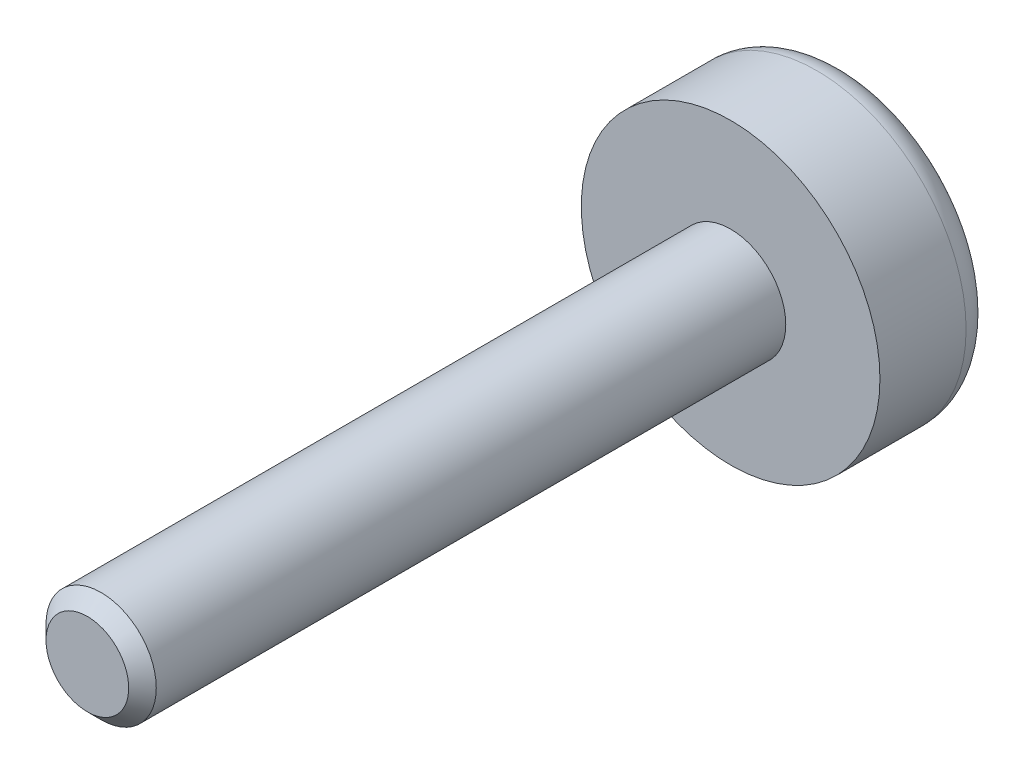
ISO-10303-21;
HEADER;
FILE_DESCRIPTION(('STEP AP214'),'2;1');
FILE_NAME('part.step','',(''),(''),'','','');
FILE_SCHEMA(('AUTOMOTIVE_DESIGN { 1 0 10303 214 1 1 1 1 }'));
ENDSEC;
DATA;
#1=APPLICATION_CONTEXT('core data for automotive mechanical design processes');
#2=APPLICATION_PROTOCOL_DEFINITION('international standard','automotive_design',2000,#1);
#3=PRODUCT_CONTEXT('',#1,'mechanical');
#4=PRODUCT('Part','Part','',(#3));
#5=PRODUCT_RELATED_PRODUCT_CATEGORY('part','',(#4));
#6=PRODUCT_DEFINITION_FORMATION('','',#4);
#7=PRODUCT_DEFINITION_CONTEXT('part definition',#1,'design');
#8=PRODUCT_DEFINITION('design','',#6,#7);
#9=PRODUCT_DEFINITION_SHAPE('','',#8);
#10=(LENGTH_UNIT() NAMED_UNIT(*) SI_UNIT(.MILLI.,.METRE.));
#11=(NAMED_UNIT(*) PLANE_ANGLE_UNIT() SI_UNIT($,.RADIAN.));
#12=(NAMED_UNIT(*) SI_UNIT($,.STERADIAN.) SOLID_ANGLE_UNIT());
#13=UNCERTAINTY_MEASURE_WITH_UNIT(LENGTH_MEASURE(1.E-05),#10,'distance_accuracy_value','');
#14=(GEOMETRIC_REPRESENTATION_CONTEXT(3) GLOBAL_UNCERTAINTY_ASSIGNED_CONTEXT((#13)) GLOBAL_UNIT_ASSIGNED_CONTEXT((#10,
#11,#12)) REPRESENTATION_CONTEXT('',''));
#15=CARTESIAN_POINT('',(0.,0.,0.));
#16=DIRECTION('',(0.,0.,1.));
#17=DIRECTION('',(1.,0.,0.));
#18=AXIS2_PLACEMENT_3D('',#15,#16,#17);
#19=CARTESIAN_POINT('',(0.,0.,14.));
#20=DIRECTION('',(0.,0.,1.));
#21=DIRECTION('',(-1.,0.,0.));
#22=AXIS2_PLACEMENT_3D('',#19,#20,#21);
#23=PLANE('',#22);
#24=CARTESIAN_POINT('',(0.,0.,14.));
#25=DIRECTION('',(0.,0.,-1.));
#26=DIRECTION('',(-1.,0.,0.));
#27=AXIS2_PLACEMENT_3D('',#24,#25,#26);
#28=CIRCLE('',#27,0.899999999999988);
#29=CARTESIAN_POINT('',(-0.899999999999988,0.,14.));
#30=VERTEX_POINT('',#29);
#31=EDGE_CURVE('E140',#30,#30,#28,.T.);
#32=ORIENTED_EDGE('',*,*,#31,.F.);
#33=EDGE_LOOP('',(#32));
#34=FACE_BOUND('',#33,.T.);
#35=ADVANCED_FACE('F41',(#34),#23,.T.);
#36=CARTESIAN_POINT('',(0.,0.,-10.123));
#37=DIRECTION('',(0.,0.,-1.));
#38=DIRECTION('',(1.,0.,0.));
#39=AXIS2_PLACEMENT_3D('',#36,#37,#38);
#40=CYLINDRICAL_SURFACE('',#39,1.2);
#41=CARTESIAN_POINT('',(0.,0.,13.7));
#42=DIRECTION('',(0.,0.,-1.));
#43=DIRECTION('',(-1.,0.,0.));
#44=AXIS2_PLACEMENT_3D('',#41,#42,#43);
#45=CIRCLE('',#44,1.2);
#46=CARTESIAN_POINT('',(-1.2,0.,13.7));
#47=VERTEX_POINT('',#46);
#48=EDGE_CURVE('E137',#47,#47,#45,.F.);
#49=ORIENTED_EDGE('',*,*,#48,.F.);
#50=EDGE_LOOP('',(#49));
#51=FACE_BOUND('',#50,.T.);
#52=CARTESIAN_POINT('',(0.,0.,0.));
#53=DIRECTION('',(0.,0.,1.));
#54=DIRECTION('',(1.,0.,0.));
#55=AXIS2_PLACEMENT_3D('',#52,#53,#54);
#56=CIRCLE('',#55,1.2);
#57=CARTESIAN_POINT('',(1.2,0.,0.));
#58=VERTEX_POINT('',#57);
#59=EDGE_CURVE('E134',#58,#58,#56,.T.);
#60=ORIENTED_EDGE('',*,*,#59,.T.);
#61=EDGE_LOOP('',(#60));
#62=FACE_BOUND('',#61,.T.);
#63=ADVANCED_FACE('F163',(#51,#62),#40,.T.);
#64=CARTESIAN_POINT('',(1.2,0.,0.));
#65=DIRECTION('',(0.,0.,1.));
#66=DIRECTION('',(-1.,0.,0.));
#67=AXIS2_PLACEMENT_3D('',#64,#65,#66);
#68=PLANE('',#67);
#69=ORIENTED_EDGE('',*,*,#59,.F.);
#70=EDGE_LOOP('',(#69));
#71=FACE_BOUND('',#70,.T.);
#72=CARTESIAN_POINT('',(0.,0.,0.));
#73=DIRECTION('',(0.,0.,1.));
#74=DIRECTION('',(1.,0.,0.));
#75=AXIS2_PLACEMENT_3D('',#72,#73,#74);
#76=CIRCLE('',#75,3.25);
#77=CARTESIAN_POINT('',(3.25,0.,0.));
#78=VERTEX_POINT('',#77);
#79=EDGE_CURVE('E131',#78,#78,#76,.T.);
#80=ORIENTED_EDGE('',*,*,#79,.T.);
#81=EDGE_LOOP('',(#80));
#82=FACE_BOUND('',#81,.T.);
#83=ADVANCED_FACE('F157',(#71,#82),#68,.T.);
#84=CARTESIAN_POINT('',(0.,0.,-10.123));
#85=DIRECTION('',(0.,0.,-1.));
#86=DIRECTION('',(1.,0.,0.));
#87=AXIS2_PLACEMENT_3D('',#84,#85,#86);
#88=CYLINDRICAL_SURFACE('',#87,3.25);
#89=CARTESIAN_POINT('',(0.,0.,-1.875));
#90=DIRECTION('',(0.,0.,1.));
#91=DIRECTION('',(1.,0.,0.));
#92=AXIS2_PLACEMENT_3D('',#89,#90,#91);
#93=CIRCLE('',#92,3.25);
#94=CARTESIAN_POINT('',(3.25,0.,-1.875));
#95=VERTEX_POINT('',#94);
#96=EDGE_CURVE('E11',#95,#95,#93,.F.);
#97=ORIENTED_EDGE('',*,*,#96,.F.);
#98=EDGE_LOOP('',(#97));
#99=FACE_BOUND('',#98,.T.);
#100=ORIENTED_EDGE('',*,*,#79,.F.);
#101=EDGE_LOOP('',(#100));
#102=FACE_BOUND('',#101,.T.);
#103=ADVANCED_FACE('F149',(#99,#102),#88,.T.);
#104=CARTESIAN_POINT('',(3.25,0.,-2.5));
#105=DIRECTION('',(0.,0.,-1.));
#106=DIRECTION('',(1.,0.,0.));
#107=AXIS2_PLACEMENT_3D('',#104,#105,#106);
#108=PLANE('',#107);
#109=DIRECTION('',(0.499999999999995,0.866025403784441,0.));
#110=VECTOR('',#109,1.);
#111=CARTESIAN_POINT('',(0.577350269189637,-0.999999999999993,-2.5));
#112=LINE('',#111,#110);
#113=CARTESIAN_POINT('',(0.577350269189637,-0.999999999999993,-2.5));
#114=VERTEX_POINT('',#113);
#115=CARTESIAN_POINT('',(1.15470053837925,0.,-2.5));
#116=VERTEX_POINT('',#115);
#117=EDGE_CURVE('E315',#114,#116,#112,.T.);
#118=ORIENTED_EDGE('',*,*,#117,.T.);
#119=DIRECTION('',(-0.500000000000001,0.866025403784438,0.));
#120=VECTOR('',#119,1.);
#121=CARTESIAN_POINT('',(1.15470053837925,0.,-2.5));
#122=LINE('',#121,#120);
#123=CARTESIAN_POINT('',(0.577350269189624,1.,-2.5));
#124=VERTEX_POINT('',#123);
#125=EDGE_CURVE('E310',#116,#124,#122,.T.);
#126=ORIENTED_EDGE('',*,*,#125,.T.);
#127=DIRECTION('',(-1.,0.,0.));
#128=VECTOR('',#127,1.);
#129=CARTESIAN_POINT('',(0.577350269189624,1.,-2.5));
#130=LINE('',#129,#128);
#131=CARTESIAN_POINT('',(-0.57735026918963,0.999999999999998,-2.5));
#132=VERTEX_POINT('',#131);
#133=EDGE_CURVE('E314',#124,#132,#130,.T.);
#134=ORIENTED_EDGE('',*,*,#133,.T.);
#135=DIRECTION('',(-0.499999999999995,-0.866025403784442,0.));
#136=VECTOR('',#135,1.);
#137=CARTESIAN_POINT('',(-0.57735026918963,0.999999999999998,-2.5));
#138=LINE('',#137,#136);
#139=CARTESIAN_POINT('',(-1.15470053837925,0.,-2.5));
#140=VERTEX_POINT('',#139);
#141=EDGE_CURVE('E322',#132,#140,#138,.T.);
#142=ORIENTED_EDGE('',*,*,#141,.T.);
#143=DIRECTION('',(0.500000000000007,-0.866025403784434,0.));
#144=VECTOR('',#143,1.);
#145=CARTESIAN_POINT('',(-1.15470053837925,0.,-2.5));
#146=LINE('',#145,#144);
#147=CARTESIAN_POINT('',(-0.577350269189617,-1.00000000000001,-2.5));
#148=VERTEX_POINT('',#147);
#149=EDGE_CURVE('E120',#140,#148,#146,.T.);
#150=ORIENTED_EDGE('',*,*,#149,.T.);
#151=DIRECTION('',(1.,0.,0.));
#152=VECTOR('',#151,1.);
#153=CARTESIAN_POINT('',(-0.577350269189617,-1.00000000000001,-2.5));
#154=LINE('',#153,#152);
#155=EDGE_CURVE('E317',#148,#114,#154,.T.);
#156=ORIENTED_EDGE('',*,*,#155,.T.);
#157=EDGE_LOOP('',(#118,#126,#134,#142,#150,#156));
#158=FACE_BOUND('',#157,.T.);
#159=CARTESIAN_POINT('',(0.,0.,-2.5));
#160=DIRECTION('',(0.,0.,1.));
#161=DIRECTION('',(1.,0.,0.));
#162=AXIS2_PLACEMENT_3D('',#159,#160,#161);
#163=CIRCLE('',#162,2.625);
#164=CARTESIAN_POINT('',(2.625,0.,-2.5));
#165=VERTEX_POINT('',#164);
#166=EDGE_CURVE('E49',#165,#165,#163,.T.);
#167=ORIENTED_EDGE('',*,*,#166,.F.);
#168=EDGE_LOOP('',(#167));
#169=FACE_BOUND('',#168,.T.);
#170=ADVANCED_FACE('F146',(#158,#169),#108,.T.);
#171=CARTESIAN_POINT('',(0.,0.,13.7));
#172=DIRECTION('',(0.,0.,-1.));
#173=DIRECTION('',(1.,0.,0.));
#174=AXIS2_PLACEMENT_3D('',#171,#172,#173);
#175=CONICAL_SURFACE('',#174,1.2,0.785398163397451);
#176=ORIENTED_EDGE('',*,*,#31,.T.);
#177=EDGE_LOOP('',(#176));
#178=FACE_BOUND('',#177,.T.);
#179=ORIENTED_EDGE('',*,*,#48,.T.);
#180=EDGE_LOOP('',(#179));
#181=FACE_BOUND('',#180,.T.);
#182=ADVANCED_FACE('F148',(#178,#181),#175,.T.);
#183=CARTESIAN_POINT('',(0.,0.,-1.875));
#184=DIRECTION('',(0.,0.,-1.));
#185=DIRECTION('',(1.,0.,0.));
#186=AXIS2_PLACEMENT_3D('',#183,#184,#185);
#187=TOROIDAL_SURFACE('',#186,2.625,0.625);
#188=ORIENTED_EDGE('',*,*,#96,.T.);
#189=EDGE_LOOP('',(#188));
#190=FACE_BOUND('',#189,.T.);
#191=ORIENTED_EDGE('',*,*,#166,.T.);
#192=EDGE_LOOP('',(#191));
#193=FACE_BOUND('',#192,.T.);
#194=ADVANCED_FACE('F43',(#190,#193),#187,.T.);
#195=CARTESIAN_POINT('',(0.577350269189637,-0.999999999999993,-1.125));
#196=DIRECTION('',(0.866025403784441,-0.499999999999995,0.));
#197=DIRECTION('',(0.499999999999995,0.866025403784441,0.));
#198=AXIS2_PLACEMENT_3D('',#195,#196,#197);
#199=PLANE('',#198);
#200=ORIENTED_EDGE('',*,*,#117,.F.);
#201=DIRECTION('',(0.,0.,-1.));
#202=VECTOR('',#201,1.);
#203=CARTESIAN_POINT('',(0.577350269189637,-0.999999999999993,-1.125));
#204=LINE('',#203,#202);
#205=CARTESIAN_POINT('',(0.577350269189637,-0.999999999999993,-1.125));
#206=VERTEX_POINT('',#205);
#207=EDGE_CURVE('E87',#206,#114,#204,.T.);
#208=ORIENTED_EDGE('',*,*,#207,.F.);
#209=DIRECTION('',(0.499999999999995,0.866025403784441,0.));
#210=VECTOR('',#209,1.);
#211=CARTESIAN_POINT('',(0.577350269189637,-0.999999999999993,-1.125));
#212=LINE('',#211,#210);
#213=CARTESIAN_POINT('',(1.15470053837925,0.,-1.125));
#214=VERTEX_POINT('',#213);
#215=EDGE_CURVE('E325',#206,#214,#212,.T.);
#216=ORIENTED_EDGE('',*,*,#215,.T.);
#217=DIRECTION('',(0.,0.,-1.));
#218=VECTOR('',#217,1.);
#219=CARTESIAN_POINT('',(1.15470053837925,0.,-1.125));
#220=LINE('',#219,#218);
#221=EDGE_CURVE('E56',#214,#116,#220,.T.);
#222=ORIENTED_EDGE('',*,*,#221,.T.);
#223=EDGE_LOOP('',(#200,#208,#216,#222));
#224=FACE_BOUND('',#223,.T.);
#225=ADVANCED_FACE('F210',(#224),#199,.F.);
#226=CARTESIAN_POINT('',(-0.577350269189617,-1.00000000000001,-1.125));
#227=DIRECTION('',(0.,-1.,0.));
#228=DIRECTION('',(1.,0.,0.));
#229=AXIS2_PLACEMENT_3D('',#226,#227,#228);
#230=PLANE('',#229);
#231=ORIENTED_EDGE('',*,*,#155,.F.);
#232=DIRECTION('',(0.,0.,-1.));
#233=VECTOR('',#232,1.);
#234=CARTESIAN_POINT('',(-0.577350269189617,-1.00000000000001,-1.125));
#235=LINE('',#234,#233);
#236=CARTESIAN_POINT('',(-0.577350269189617,-1.00000000000001,-1.125));
#237=VERTEX_POINT('',#236);
#238=EDGE_CURVE('E122',#237,#148,#235,.T.);
#239=ORIENTED_EDGE('',*,*,#238,.F.);
#240=DIRECTION('',(1.,0.,0.));
#241=VECTOR('',#240,1.);
#242=CARTESIAN_POINT('',(-0.577350269189617,-1.00000000000001,-1.125));
#243=LINE('',#242,#241);
#244=EDGE_CURVE('E65',#237,#206,#243,.T.);
#245=ORIENTED_EDGE('',*,*,#244,.T.);
#246=ORIENTED_EDGE('',*,*,#207,.T.);
#247=EDGE_LOOP('',(#231,#239,#245,#246));
#248=FACE_BOUND('',#247,.T.);
#249=ADVANCED_FACE('F220',(#248),#230,.F.);
#250=CARTESIAN_POINT('',(-1.15470053837925,0.,-1.125));
#251=DIRECTION('',(-0.866025403784435,-0.500000000000007,0.));
#252=DIRECTION('',(0.500000000000007,-0.866025403784435,0.));
#253=AXIS2_PLACEMENT_3D('',#250,#251,#252);
#254=PLANE('',#253);
#255=ORIENTED_EDGE('',*,*,#149,.F.);
#256=DIRECTION('',(0.,0.,-1.));
#257=VECTOR('',#256,1.);
#258=CARTESIAN_POINT('',(-1.15470053837925,0.,-1.125));
#259=LINE('',#258,#257);
#260=CARTESIAN_POINT('',(-1.15470053837925,0.,-1.125));
#261=VERTEX_POINT('',#260);
#262=EDGE_CURVE('E109',#261,#140,#259,.T.);
#263=ORIENTED_EDGE('',*,*,#262,.F.);
#264=DIRECTION('',(0.500000000000007,-0.866025403784434,0.));
#265=VECTOR('',#264,1.);
#266=CARTESIAN_POINT('',(-1.15470053837925,0.,-1.125));
#267=LINE('',#266,#265);
#268=EDGE_CURVE('E112',#261,#237,#267,.T.);
#269=ORIENTED_EDGE('',*,*,#268,.T.);
#270=ORIENTED_EDGE('',*,*,#238,.T.);
#271=EDGE_LOOP('',(#255,#263,#269,#270));
#272=FACE_BOUND('',#271,.T.);
#273=ADVANCED_FACE('F118',(#272),#254,.F.);
#274=CARTESIAN_POINT('',(-0.57735026918963,0.999999999999998,-1.125));
#275=DIRECTION('',(-0.866025403784442,0.499999999999995,0.));
#276=DIRECTION('',(-0.499999999999995,-0.866025403784441,0.));
#277=AXIS2_PLACEMENT_3D('',#274,#275,#276);
#278=PLANE('',#277);
#279=ORIENTED_EDGE('',*,*,#141,.F.);
#280=DIRECTION('',(0.,0.,-1.));
#281=VECTOR('',#280,1.);
#282=CARTESIAN_POINT('',(-0.57735026918963,0.999999999999998,-1.125));
#283=LINE('',#282,#281);
#284=CARTESIAN_POINT('',(-0.57735026918963,0.999999999999998,-1.125));
#285=VERTEX_POINT('',#284);
#286=EDGE_CURVE('E111',#285,#132,#283,.T.);
#287=ORIENTED_EDGE('',*,*,#286,.F.);
#288=DIRECTION('',(-0.499999999999995,-0.866025403784442,0.));
#289=VECTOR('',#288,1.);
#290=CARTESIAN_POINT('',(-0.57735026918963,0.999999999999998,-1.125));
#291=LINE('',#290,#289);
#292=EDGE_CURVE('E104',#285,#261,#291,.T.);
#293=ORIENTED_EDGE('',*,*,#292,.T.);
#294=ORIENTED_EDGE('',*,*,#262,.T.);
#295=EDGE_LOOP('',(#279,#287,#293,#294));
#296=FACE_BOUND('',#295,.T.);
#297=ADVANCED_FACE('F107',(#296),#278,.F.);
#298=CARTESIAN_POINT('',(0.577350269189624,1.,-1.125));
#299=DIRECTION('',(0.,1.,0.));
#300=DIRECTION('',(-1.,0.,0.));
#301=AXIS2_PLACEMENT_3D('',#298,#299,#300);
#302=PLANE('',#301);
#303=ORIENTED_EDGE('',*,*,#133,.F.);
#304=DIRECTION('',(0.,0.,-1.));
#305=VECTOR('',#304,1.);
#306=CARTESIAN_POINT('',(0.577350269189624,1.,-1.125));
#307=LINE('',#306,#305);
#308=CARTESIAN_POINT('',(0.577350269189624,1.,-1.125));
#309=VERTEX_POINT('',#308);
#310=EDGE_CURVE('E125',#309,#124,#307,.T.);
#311=ORIENTED_EDGE('',*,*,#310,.F.);
#312=DIRECTION('',(-1.,0.,0.));
#313=VECTOR('',#312,1.);
#314=CARTESIAN_POINT('',(0.577350269189624,1.,-1.125));
#315=LINE('',#314,#313);
#316=EDGE_CURVE('E113',#309,#285,#315,.T.);
#317=ORIENTED_EDGE('',*,*,#316,.T.);
#318=ORIENTED_EDGE('',*,*,#286,.T.);
#319=EDGE_LOOP('',(#303,#311,#317,#318));
#320=FACE_BOUND('',#319,.T.);
#321=ADVANCED_FACE('F247',(#320),#302,.F.);
#322=CARTESIAN_POINT('',(1.15470053837925,0.,-1.125));
#323=DIRECTION('',(0.866025403784438,0.500000000000001,0.));
#324=DIRECTION('',(-0.500000000000001,0.866025403784438,0.));
#325=AXIS2_PLACEMENT_3D('',#322,#323,#324);
#326=PLANE('',#325);
#327=ORIENTED_EDGE('',*,*,#125,.F.);
#328=ORIENTED_EDGE('',*,*,#221,.F.);
#329=DIRECTION('',(-0.500000000000001,0.866025403784438,0.));
#330=VECTOR('',#329,1.);
#331=CARTESIAN_POINT('',(1.15470053837925,0.,-1.125));
#332=LINE('',#331,#330);
#333=EDGE_CURVE('E95',#214,#309,#332,.T.);
#334=ORIENTED_EDGE('',*,*,#333,.T.);
#335=ORIENTED_EDGE('',*,*,#310,.T.);
#336=EDGE_LOOP('',(#327,#328,#334,#335));
#337=FACE_BOUND('',#336,.T.);
#338=ADVANCED_FACE('F257',(#337),#326,.F.);
#339=CARTESIAN_POINT('',(0.,0.,-1.125));
#340=DIRECTION('',(0.,0.,-1.));
#341=DIRECTION('',(1.,0.,0.));
#342=AXIS2_PLACEMENT_3D('',#339,#340,#341);
#343=PLANE('',#342);
#344=ORIENTED_EDGE('',*,*,#215,.F.);
#345=ORIENTED_EDGE('',*,*,#244,.F.);
#346=ORIENTED_EDGE('',*,*,#268,.F.);
#347=ORIENTED_EDGE('',*,*,#292,.F.);
#348=ORIENTED_EDGE('',*,*,#316,.F.);
#349=ORIENTED_EDGE('',*,*,#333,.F.);
#350=EDGE_LOOP('',(#344,#345,#346,#347,#348,#349));
#351=FACE_BOUND('',#350,.T.);
#352=ADVANCED_FACE('F115',(#351),#343,.T.);
#353=CLOSED_SHELL('',(#35,#63,#83,#103,#170,#182,#194,#225,#249,#273,#297,#321,#338,#352));
#354=MANIFOLD_SOLID_BREP('B2',#353);
#355=ADVANCED_BREP_SHAPE_REPRESENTATION('',(#18,#354),#14);
#356=SHAPE_DEFINITION_REPRESENTATION(#9,#355);
ENDSEC;
END-ISO-10303-21;
